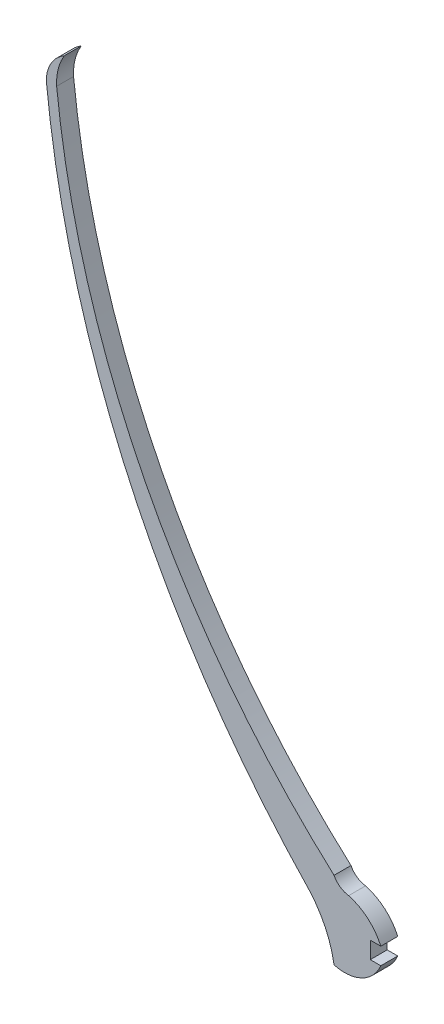
ISO-10303-21;
HEADER;
FILE_DESCRIPTION(('STEP AP214'),'2;1');
FILE_NAME('part.step','',(''),(''),'','','');
FILE_SCHEMA(('AUTOMOTIVE_DESIGN { 1 0 10303 214 1 1 1 1 }'));
ENDSEC;
DATA;
#1=APPLICATION_CONTEXT('core data for automotive mechanical design processes');
#2=APPLICATION_PROTOCOL_DEFINITION('international standard','automotive_design',2000,#1);
#3=PRODUCT_CONTEXT('',#1,'mechanical');
#4=PRODUCT('Part','Part','',(#3));
#5=PRODUCT_RELATED_PRODUCT_CATEGORY('part','',(#4));
#6=PRODUCT_DEFINITION_FORMATION('','',#4);
#7=PRODUCT_DEFINITION_CONTEXT('part definition',#1,'design');
#8=PRODUCT_DEFINITION('design','',#6,#7);
#9=PRODUCT_DEFINITION_SHAPE('','',#8);
#10=(LENGTH_UNIT() NAMED_UNIT(*) SI_UNIT(.MILLI.,.METRE.));
#11=(NAMED_UNIT(*) PLANE_ANGLE_UNIT() SI_UNIT($,.RADIAN.));
#12=(NAMED_UNIT(*) SI_UNIT($,.STERADIAN.) SOLID_ANGLE_UNIT());
#13=UNCERTAINTY_MEASURE_WITH_UNIT(LENGTH_MEASURE(1.E-05),#10,'distance_accuracy_value','');
#14=(GEOMETRIC_REPRESENTATION_CONTEXT(3) GLOBAL_UNCERTAINTY_ASSIGNED_CONTEXT((#13)) GLOBAL_UNIT_ASSIGNED_CONTEXT((#10,
#11,#12)) REPRESENTATION_CONTEXT('',''));
#15=CARTESIAN_POINT('',(0.,0.,0.));
#16=DIRECTION('',(0.,0.,1.));
#17=DIRECTION('',(1.,0.,0.));
#18=AXIS2_PLACEMENT_3D('',#15,#16,#17);
#19=CARTESIAN_POINT('',(-12.3904962831475,1.61861811782142E-13,1.524));
#20=DIRECTION('',(1.5935205726894E-13,1.,0.));
#21=DIRECTION('',(-1.,1.5935205726894E-13,0.));
#22=AXIS2_PLACEMENT_3D('',#19,#20,#21);
#23=PLANE('',#22);
#24=DIRECTION('',(1.,-1.5935205726894E-13,0.));
#25=VECTOR('',#24,1.);
#26=CARTESIAN_POINT('',(-12.3904962831475,1.61861811782142E-13,0.));
#27=LINE('',#26,#25);
#28=CARTESIAN_POINT('',(-12.3904962831475,1.61861811782142E-13,0.));
#29=VERTEX_POINT('',#28);
#30=CARTESIAN_POINT('',(-11.4404950986682,0.,0.));
#31=VERTEX_POINT('',#30);
#32=EDGE_CURVE('E147',#29,#31,#27,.T.);
#33=ORIENTED_EDGE('',*,*,#32,.T.);
#34=DIRECTION('',(0.,0.,-1.));
#35=VECTOR('',#34,1.);
#36=CARTESIAN_POINT('',(-11.4404950986682,0.,1.524));
#37=LINE('',#36,#35);
#38=CARTESIAN_POINT('',(-11.4404950986682,0.,1.524));
#39=VERTEX_POINT('',#38);
#40=EDGE_CURVE('E11',#39,#31,#37,.T.);
#41=ORIENTED_EDGE('',*,*,#40,.F.);
#42=DIRECTION('',(1.,-1.5935205726894E-13,0.));
#43=VECTOR('',#42,1.);
#44=CARTESIAN_POINT('',(-12.3904962831475,1.61861811782142E-13,1.524));
#45=LINE('',#44,#43);
#46=CARTESIAN_POINT('',(-12.3904962831475,1.61861811782142E-13,1.524));
#47=VERTEX_POINT('',#46);
#48=EDGE_CURVE('E167',#47,#39,#45,.T.);
#49=ORIENTED_EDGE('',*,*,#48,.F.);
#50=DIRECTION('',(0.,0.,-1.));
#51=VECTOR('',#50,1.);
#52=CARTESIAN_POINT('',(-12.3904962831475,1.61861811782142E-13,1.524));
#53=LINE('',#52,#51);
#54=EDGE_CURVE('E143',#47,#29,#53,.T.);
#55=ORIENTED_EDGE('',*,*,#54,.T.);
#56=EDGE_LOOP('',(#33,#41,#49,#55));
#57=FACE_BOUND('',#56,.T.);
#58=ADVANCED_FACE('F33',(#57),#23,.F.);
#59=CARTESIAN_POINT('',(-15.5297755176953,-1.81654813471622,1.524));
#60=DIRECTION('',(0.,0.,-1.));
#61=DIRECTION('',(-1.,0.,0.));
#62=AXIS2_PLACEMENT_3D('',#59,#60,#61);
#63=CYLINDRICAL_SURFACE('',#62,4.47460182264069);
#64=CARTESIAN_POINT('',(-15.5297755176953,-1.81654813471622,0.));
#65=DIRECTION('',(0.,0.,1.));
#66=DIRECTION('',(1.,0.,0.));
#67=AXIS2_PLACEMENT_3D('',#64,#65,#66);
#68=CIRCLE('',#67,4.47460182264069);
#69=CARTESIAN_POINT('',(-14.3380105168518,2.49642736416433,0.));
#70=VERTEX_POINT('',#69);
#71=EDGE_CURVE('E150',#31,#70,#68,.T.);
#72=ORIENTED_EDGE('',*,*,#71,.T.);
#73=DIRECTION('',(0.,0.,-1.));
#74=VECTOR('',#73,1.);
#75=CARTESIAN_POINT('',(-14.3380105168518,2.49642736416433,1.524));
#76=LINE('',#75,#74);
#77=CARTESIAN_POINT('',(-14.3380105168518,2.49642736416433,1.524));
#78=VERTEX_POINT('',#77);
#79=EDGE_CURVE('E41',#78,#70,#76,.T.);
#80=ORIENTED_EDGE('',*,*,#79,.F.);
#81=CARTESIAN_POINT('',(-15.5297755176953,-1.81654813471622,1.524));
#82=DIRECTION('',(0.,0.,1.));
#83=DIRECTION('',(1.,0.,0.));
#84=AXIS2_PLACEMENT_3D('',#81,#82,#83);
#85=CIRCLE('',#84,4.47460182264069);
#86=EDGE_CURVE('E101',#39,#78,#85,.T.);
#87=ORIENTED_EDGE('',*,*,#86,.F.);
#88=ORIENTED_EDGE('',*,*,#40,.T.);
#89=EDGE_LOOP('',(#72,#80,#87,#88));
#90=FACE_BOUND('',#89,.T.);
#91=ADVANCED_FACE('F239',(#90),#63,.T.);
#92=CARTESIAN_POINT('',(-14.1129915326588,4.2090800104054,1.524));
#93=DIRECTION('',(0.,0.,-1.));
#94=DIRECTION('',(-1.,0.,0.));
#95=AXIS2_PLACEMENT_3D('',#92,#93,#94);
#96=CYLINDRICAL_SURFACE('',#95,1.7273715957847);
#97=CARTESIAN_POINT('',(-14.1129915326588,4.2090800104054,0.));
#98=DIRECTION('',(0.,0.,-1.));
#99=DIRECTION('',(-1.,0.,0.));
#100=AXIS2_PLACEMENT_3D('',#97,#98,#99);
#101=CIRCLE('',#100,1.7273715957847);
#102=CARTESIAN_POINT('',(-15.6521729056749,3.42503069379061,0.));
#103=VERTEX_POINT('',#102);
#104=EDGE_CURVE('E152',#70,#103,#101,.T.);
#105=ORIENTED_EDGE('',*,*,#104,.T.);
#106=DIRECTION('',(0.,0.,-1.));
#107=VECTOR('',#106,1.);
#108=CARTESIAN_POINT('',(-15.6521729056749,3.42503069379061,1.524));
#109=LINE('',#108,#107);
#110=CARTESIAN_POINT('',(-15.6521729056749,3.42503069379061,1.524));
#111=VERTEX_POINT('',#110);
#112=EDGE_CURVE('E183',#111,#103,#109,.T.);
#113=ORIENTED_EDGE('',*,*,#112,.F.);
#114=CARTESIAN_POINT('',(-14.1129915326588,4.2090800104054,1.524));
#115=DIRECTION('',(0.,0.,-1.));
#116=DIRECTION('',(-1.,0.,0.));
#117=AXIS2_PLACEMENT_3D('',#114,#115,#116);
#118=CIRCLE('',#117,1.7273715957847);
#119=EDGE_CURVE('E191',#78,#111,#118,.T.);
#120=ORIENTED_EDGE('',*,*,#119,.F.);
#121=ORIENTED_EDGE('',*,*,#79,.T.);
#122=EDGE_LOOP('',(#105,#113,#120,#121));
#123=FACE_BOUND('',#122,.T.);
#124=ADVANCED_FACE('F189',(#123),#96,.F.);
#125=CARTESIAN_POINT('',(35.9655848365395,60.6058120303223,1.524));
#126=DIRECTION('',(0.,0.,-1.));
#127=DIRECTION('',(-1.,0.,0.));
#128=AXIS2_PLACEMENT_3D('',#125,#126,#127);
#129=CYLINDRICAL_SURFACE('',#128,77.0326857158063);
#130=CARTESIAN_POINT('',(35.9655848365395,60.6058120303223,0.));
#131=DIRECTION('',(0.,0.,-1.));
#132=DIRECTION('',(-1.,0.,0.));
#133=AXIS2_PLACEMENT_3D('',#130,#131,#132);
#134=CIRCLE('',#133,77.0326857158063);
#135=CARTESIAN_POINT('',(-40.6364988221983,52.4722121059398,0.));
#136=VERTEX_POINT('',#135);
#137=EDGE_CURVE('E154',#103,#136,#134,.T.);
#138=ORIENTED_EDGE('',*,*,#137,.T.);
#139=DIRECTION('',(0.,0.,-1.));
#140=VECTOR('',#139,1.);
#141=CARTESIAN_POINT('',(-40.6364988221983,52.4722121059398,1.524));
#142=LINE('',#141,#140);
#143=CARTESIAN_POINT('',(-40.6364988221983,52.4722121059398,1.524));
#144=VERTEX_POINT('',#143);
#145=EDGE_CURVE('E180',#144,#136,#142,.T.);
#146=ORIENTED_EDGE('',*,*,#145,.F.);
#147=CARTESIAN_POINT('',(35.9655848365395,60.6058120303223,1.524));
#148=DIRECTION('',(0.,0.,-1.));
#149=DIRECTION('',(-1.,0.,0.));
#150=AXIS2_PLACEMENT_3D('',#147,#148,#149);
#151=CIRCLE('',#150,77.0326857158063);
#152=EDGE_CURVE('E209',#111,#144,#151,.T.);
#153=ORIENTED_EDGE('',*,*,#152,.F.);
#154=ORIENTED_EDGE('',*,*,#112,.T.);
#155=EDGE_LOOP('',(#138,#146,#153,#154));
#156=FACE_BOUND('',#155,.T.);
#157=ADVANCED_FACE('F200',(#156),#129,.F.);
#158=CARTESIAN_POINT('',(-35.894741369534,52.7267146435933,1.524));
#159=DIRECTION('',(0.,0.,-1.));
#160=DIRECTION('',(-1.,0.,0.));
#161=AXIS2_PLACEMENT_3D('',#158,#159,#160);
#162=CYLINDRICAL_SURFACE('',#161,4.74858244969698);
#163=CARTESIAN_POINT('',(-35.894741369534,52.7267146435933,0.));
#164=DIRECTION('',(0.,0.,-1.));
#165=DIRECTION('',(1.,0.,0.));
#166=AXIS2_PLACEMENT_3D('',#163,#164,#165);
#167=CIRCLE('',#166,4.74858244969698);
#168=CARTESIAN_POINT('',(-39.9528950716288,55.1925661824626,0.));
#169=VERTEX_POINT('',#168);
#170=EDGE_CURVE('E156',#136,#169,#167,.T.);
#171=ORIENTED_EDGE('',*,*,#170,.T.);
#172=DIRECTION('',(0.,0.,-1.));
#173=VECTOR('',#172,1.);
#174=CARTESIAN_POINT('',(-39.9528950716288,55.1925661824626,1.524));
#175=LINE('',#174,#173);
#176=CARTESIAN_POINT('',(-39.9528950716288,55.1925661824626,1.524));
#177=VERTEX_POINT('',#176);
#178=EDGE_CURVE('E177',#177,#169,#175,.T.);
#179=ORIENTED_EDGE('',*,*,#178,.F.);
#180=CARTESIAN_POINT('',(-35.894741369534,52.7267146435933,1.524));
#181=DIRECTION('',(0.,0.,-1.));
#182=DIRECTION('',(1.,0.,0.));
#183=AXIS2_PLACEMENT_3D('',#180,#181,#182);
#184=CIRCLE('',#183,4.74858244969698);
#185=EDGE_CURVE('E206',#144,#177,#184,.T.);
#186=ORIENTED_EDGE('',*,*,#185,.F.);
#187=ORIENTED_EDGE('',*,*,#145,.T.);
#188=EDGE_LOOP('',(#171,#179,#186,#187));
#189=FACE_BOUND('',#188,.T.);
#190=ADVANCED_FACE('F204',(#189),#162,.F.);
#191=CARTESIAN_POINT('',(-38.3565230676943,52.4012560588709,1.524));
#192=DIRECTION('',(0.,0.,-1.));
#193=DIRECTION('',(-1.,0.,0.));
#194=AXIS2_PLACEMENT_3D('',#191,#192,#193);
#195=CYLINDRICAL_SURFACE('',#194,3.21555839334498);
#196=CARTESIAN_POINT('',(-38.3565230676943,52.4012560588709,0.));
#197=DIRECTION('',(0.,0.,1.));
#198=DIRECTION('',(-1.,0.,0.));
#199=AXIS2_PLACEMENT_3D('',#196,#197,#198);
#200=CIRCLE('',#199,3.21555839334498);
#201=CARTESIAN_POINT('',(-41.5712984907053,52.4722121059397,0.));
#202=VERTEX_POINT('',#201);
#203=EDGE_CURVE('E158',#169,#202,#200,.T.);
#204=ORIENTED_EDGE('',*,*,#203,.T.);
#205=DIRECTION('',(0.,0.,-1.));
#206=VECTOR('',#205,1.);
#207=CARTESIAN_POINT('',(-41.5712984907053,52.4722121059397,1.524));
#208=LINE('',#207,#206);
#209=CARTESIAN_POINT('',(-41.5712984907053,52.4722121059397,1.524));
#210=VERTEX_POINT('',#209);
#211=EDGE_CURVE('E174',#210,#202,#208,.T.);
#212=ORIENTED_EDGE('',*,*,#211,.F.);
#213=CARTESIAN_POINT('',(-38.3565230676943,52.4012560588709,1.524));
#214=DIRECTION('',(0.,0.,1.));
#215=DIRECTION('',(-1.,0.,0.));
#216=AXIS2_PLACEMENT_3D('',#213,#214,#215);
#217=CIRCLE('',#216,3.21555839334498);
#218=EDGE_CURVE('E208',#177,#210,#217,.T.);
#219=ORIENTED_EDGE('',*,*,#218,.F.);
#220=ORIENTED_EDGE('',*,*,#178,.T.);
#221=EDGE_LOOP('',(#204,#212,#219,#220));
#222=FACE_BOUND('',#221,.T.);
#223=ADVANCED_FACE('F252',(#222),#195,.T.);
#224=CARTESIAN_POINT('',(45.0263385591987,61.304992750638,1.524));
#225=DIRECTION('',(0.,0.,-1.));
#226=DIRECTION('',(-1.,0.,0.));
#227=AXIS2_PLACEMENT_3D('',#224,#225,#226);
#228=CYLINDRICAL_SURFACE('',#227,87.046934216802);
#229=CARTESIAN_POINT('',(45.0263385591987,61.304992750638,0.));
#230=DIRECTION('',(0.,0.,1.));
#231=DIRECTION('',(-1.,0.,0.));
#232=AXIS2_PLACEMENT_3D('',#229,#230,#231);
#233=CIRCLE('',#232,87.046934216802);
#234=CARTESIAN_POINT('',(-17.8982339825211,1.15794854241358,0.));
#235=VERTEX_POINT('',#234);
#236=EDGE_CURVE('E160',#202,#235,#233,.T.);
#237=ORIENTED_EDGE('',*,*,#236,.T.);
#238=DIRECTION('',(0.,0.,-1.));
#239=VECTOR('',#238,1.);
#240=CARTESIAN_POINT('',(-17.8982339825211,1.15794854241358,1.524));
#241=LINE('',#240,#239);
#242=CARTESIAN_POINT('',(-17.8982339825211,1.15794854241358,1.524));
#243=VERTEX_POINT('',#242);
#244=EDGE_CURVE('E171',#243,#235,#241,.T.);
#245=ORIENTED_EDGE('',*,*,#244,.F.);
#246=CARTESIAN_POINT('',(45.0263385591987,61.304992750638,1.524));
#247=DIRECTION('',(0.,0.,1.));
#248=DIRECTION('',(-1.,0.,0.));
#249=AXIS2_PLACEMENT_3D('',#246,#247,#248);
#250=CIRCLE('',#249,87.046934216802);
#251=EDGE_CURVE('E211',#210,#243,#250,.T.);
#252=ORIENTED_EDGE('',*,*,#251,.F.);
#253=ORIENTED_EDGE('',*,*,#211,.T.);
#254=EDGE_LOOP('',(#237,#245,#252,#253));
#255=FACE_BOUND('',#254,.T.);
#256=ADVANCED_FACE('F220',(#255),#228,.T.);
#257=CARTESIAN_POINT('',(-24.8053667286863,-5.0237028187747,1.524));
#258=DIRECTION('',(0.,0.,-1.));
#259=DIRECTION('',(-1.,0.,0.));
#260=AXIS2_PLACEMENT_3D('',#257,#258,#259);
#261=CYLINDRICAL_SURFACE('',#260,9.26937410640162);
#262=CARTESIAN_POINT('',(-24.8053667286863,-5.0237028187747,0.));
#263=DIRECTION('',(0.,0.,-1.));
#264=DIRECTION('',(1.,0.,0.));
#265=AXIS2_PLACEMENT_3D('',#262,#263,#264);
#266=CIRCLE('',#265,9.26937410640162);
#267=CARTESIAN_POINT('',(-15.6521729056749,-3.5607130160713,0.));
#268=VERTEX_POINT('',#267);
#269=EDGE_CURVE('E162',#235,#268,#266,.T.);
#270=ORIENTED_EDGE('',*,*,#269,.T.);
#271=DIRECTION('',(0.,0.,-1.));
#272=VECTOR('',#271,1.);
#273=CARTESIAN_POINT('',(-15.6521729056749,-3.5607130160713,1.524));
#274=LINE('',#273,#272);
#275=CARTESIAN_POINT('',(-15.6521729056749,-3.5607130160713,1.524));
#276=VERTEX_POINT('',#275);
#277=EDGE_CURVE('E138',#276,#268,#274,.T.);
#278=ORIENTED_EDGE('',*,*,#277,.F.);
#279=CARTESIAN_POINT('',(-24.8053667286863,-5.0237028187747,1.524));
#280=DIRECTION('',(0.,0.,-1.));
#281=DIRECTION('',(1.,0.,0.));
#282=AXIS2_PLACEMENT_3D('',#279,#280,#281);
#283=CIRCLE('',#282,9.26937410640162);
#284=EDGE_CURVE('E129',#243,#276,#283,.T.);
#285=ORIENTED_EDGE('',*,*,#284,.F.);
#286=ORIENTED_EDGE('',*,*,#244,.T.);
#287=EDGE_LOOP('',(#270,#278,#285,#286));
#288=FACE_BOUND('',#287,.T.);
#289=ADVANCED_FACE('F224',(#288),#261,.F.);
#290=CARTESIAN_POINT('',(-14.6975920273401,-0.161693235164071,1.524));
#291=DIRECTION('',(0.,0.,-1.));
#292=DIRECTION('',(-1.,0.,0.));
#293=AXIS2_PLACEMENT_3D('',#290,#291,#292);
#294=CYLINDRICAL_SURFACE('',#293,3.53051839313735);
#295=CARTESIAN_POINT('',(-14.6975920273401,-0.161693235164071,0.));
#296=DIRECTION('',(0.,0.,1.));
#297=DIRECTION('',(-1.,0.,0.));
#298=AXIS2_PLACEMENT_3D('',#295,#296,#297);
#299=CIRCLE('',#298,3.53051839313735);
#300=CARTESIAN_POINT('',(-11.4404950986682,-1.52399999999984,0.));
#301=VERTEX_POINT('',#300);
#302=EDGE_CURVE('E137',#268,#301,#299,.T.);
#303=ORIENTED_EDGE('',*,*,#302,.T.);
#304=DIRECTION('',(0.,0.,-1.));
#305=VECTOR('',#304,1.);
#306=CARTESIAN_POINT('',(-11.4404950986682,-1.52399999999984,1.524));
#307=LINE('',#306,#305);
#308=CARTESIAN_POINT('',(-11.4404950986682,-1.52399999999984,1.524));
#309=VERTEX_POINT('',#308);
#310=EDGE_CURVE('E134',#309,#301,#307,.T.);
#311=ORIENTED_EDGE('',*,*,#310,.F.);
#312=CARTESIAN_POINT('',(-14.6975920273401,-0.161693235164071,1.524));
#313=DIRECTION('',(0.,0.,1.));
#314=DIRECTION('',(-1.,0.,0.));
#315=AXIS2_PLACEMENT_3D('',#312,#313,#314);
#316=CIRCLE('',#315,3.53051839313735);
#317=EDGE_CURVE('E123',#276,#309,#316,.T.);
#318=ORIENTED_EDGE('',*,*,#317,.F.);
#319=ORIENTED_EDGE('',*,*,#277,.T.);
#320=EDGE_LOOP('',(#303,#311,#318,#319));
#321=FACE_BOUND('',#320,.T.);
#322=ADVANCED_FACE('F135',(#321),#294,.T.);
#323=CARTESIAN_POINT('',(-12.3904962831475,-1.52399999999984,1.524));
#324=DIRECTION('',(0.,-1.,0.));
#325=DIRECTION('',(0.,0.,-1.));
#326=AXIS2_PLACEMENT_3D('',#323,#324,#325);
#327=PLANE('',#326);
#328=DIRECTION('',(-1.,0.,0.));
#329=VECTOR('',#328,1.);
#330=CARTESIAN_POINT('',(-12.3904962831475,-1.52399999999984,0.));
#331=LINE('',#330,#329);
#332=CARTESIAN_POINT('',(-12.3904962831475,-1.52399999999984,0.));
#333=VERTEX_POINT('',#332);
#334=EDGE_CURVE('E87',#301,#333,#331,.T.);
#335=ORIENTED_EDGE('',*,*,#334,.T.);
#336=DIRECTION('',(0.,0.,-1.));
#337=VECTOR('',#336,1.);
#338=CARTESIAN_POINT('',(-12.3904962831475,-1.52399999999984,1.524));
#339=LINE('',#338,#337);
#340=CARTESIAN_POINT('',(-12.3904962831475,-1.52399999999984,1.524));
#341=VERTEX_POINT('',#340);
#342=EDGE_CURVE('E139',#341,#333,#339,.T.);
#343=ORIENTED_EDGE('',*,*,#342,.F.);
#344=DIRECTION('',(-1.,0.,0.));
#345=VECTOR('',#344,1.);
#346=CARTESIAN_POINT('',(-12.3904962831475,-1.52399999999984,1.524));
#347=LINE('',#346,#345);
#348=EDGE_CURVE('E127',#309,#341,#347,.T.);
#349=ORIENTED_EDGE('',*,*,#348,.F.);
#350=ORIENTED_EDGE('',*,*,#310,.T.);
#351=EDGE_LOOP('',(#335,#343,#349,#350));
#352=FACE_BOUND('',#351,.T.);
#353=ADVANCED_FACE('F141',(#352),#327,.F.);
#354=CARTESIAN_POINT('',(-12.3904962831475,1.61861811782142E-13,1.524));
#355=DIRECTION('',(-1.,0.,0.));
#356=DIRECTION('',(0.,0.,1.));
#357=AXIS2_PLACEMENT_3D('',#354,#355,#356);
#358=PLANE('',#357);
#359=DIRECTION('',(0.,1.,0.));
#360=VECTOR('',#359,1.);
#361=CARTESIAN_POINT('',(-12.3904962831475,1.61861811782142E-13,0.));
#362=LINE('',#361,#360);
#363=EDGE_CURVE('E93',#333,#29,#362,.T.);
#364=ORIENTED_EDGE('',*,*,#363,.T.);
#365=ORIENTED_EDGE('',*,*,#54,.F.);
#366=DIRECTION('',(0.,1.,0.));
#367=VECTOR('',#366,1.);
#368=CARTESIAN_POINT('',(-12.3904962831475,1.61861811782142E-13,1.524));
#369=LINE('',#368,#367);
#370=EDGE_CURVE('E49',#341,#47,#369,.T.);
#371=ORIENTED_EDGE('',*,*,#370,.F.);
#372=ORIENTED_EDGE('',*,*,#342,.T.);
#373=EDGE_LOOP('',(#364,#365,#371,#372));
#374=FACE_BOUND('',#373,.T.);
#375=ADVANCED_FACE('F228',(#374),#358,.F.);
#376=CARTESIAN_POINT('',(-15.5297755176953,-1.81654813471622,1.524));
#377=DIRECTION('',(0.,0.,1.));
#378=DIRECTION('',(1.,0.,0.));
#379=AXIS2_PLACEMENT_3D('',#376,#377,#378);
#380=PLANE('',#379);
#381=ORIENTED_EDGE('',*,*,#48,.T.);
#382=ORIENTED_EDGE('',*,*,#86,.T.);
#383=ORIENTED_EDGE('',*,*,#119,.T.);
#384=ORIENTED_EDGE('',*,*,#152,.T.);
#385=ORIENTED_EDGE('',*,*,#185,.T.);
#386=ORIENTED_EDGE('',*,*,#218,.T.);
#387=ORIENTED_EDGE('',*,*,#251,.T.);
#388=ORIENTED_EDGE('',*,*,#284,.T.);
#389=ORIENTED_EDGE('',*,*,#317,.T.);
#390=ORIENTED_EDGE('',*,*,#348,.T.);
#391=ORIENTED_EDGE('',*,*,#370,.T.);
#392=EDGE_LOOP('',(#381,#382,#383,#384,#385,#386,#387,#388,#389,#390,#391));
#393=FACE_BOUND('',#392,.T.);
#394=ADVANCED_FACE('F125',(#393),#380,.T.);
#395=CARTESIAN_POINT('',(-15.5297755176953,-1.81654813471622,0.));
#396=DIRECTION('',(0.,0.,1.));
#397=DIRECTION('',(1.,0.,0.));
#398=AXIS2_PLACEMENT_3D('',#395,#396,#397);
#399=PLANE('',#398);
#400=ORIENTED_EDGE('',*,*,#32,.F.);
#401=ORIENTED_EDGE('',*,*,#363,.F.);
#402=ORIENTED_EDGE('',*,*,#334,.F.);
#403=ORIENTED_EDGE('',*,*,#302,.F.);
#404=ORIENTED_EDGE('',*,*,#269,.F.);
#405=ORIENTED_EDGE('',*,*,#236,.F.);
#406=ORIENTED_EDGE('',*,*,#203,.F.);
#407=ORIENTED_EDGE('',*,*,#170,.F.);
#408=ORIENTED_EDGE('',*,*,#137,.F.);
#409=ORIENTED_EDGE('',*,*,#104,.F.);
#410=ORIENTED_EDGE('',*,*,#71,.F.);
#411=EDGE_LOOP('',(#400,#401,#402,#403,#404,#405,#406,#407,#408,#409,#410));
#412=FACE_BOUND('',#411,.T.);
#413=ADVANCED_FACE('F195',(#412),#399,.F.);
#414=CLOSED_SHELL('',(#58,#91,#124,#157,#190,#223,#256,#289,#322,#353,#375,#394,#413));
#415=MANIFOLD_SOLID_BREP('B2',#414);
#416=ADVANCED_BREP_SHAPE_REPRESENTATION('',(#18,#415),#14);
#417=SHAPE_DEFINITION_REPRESENTATION(#9,#416);
ENDSEC;
END-ISO-10303-21;
